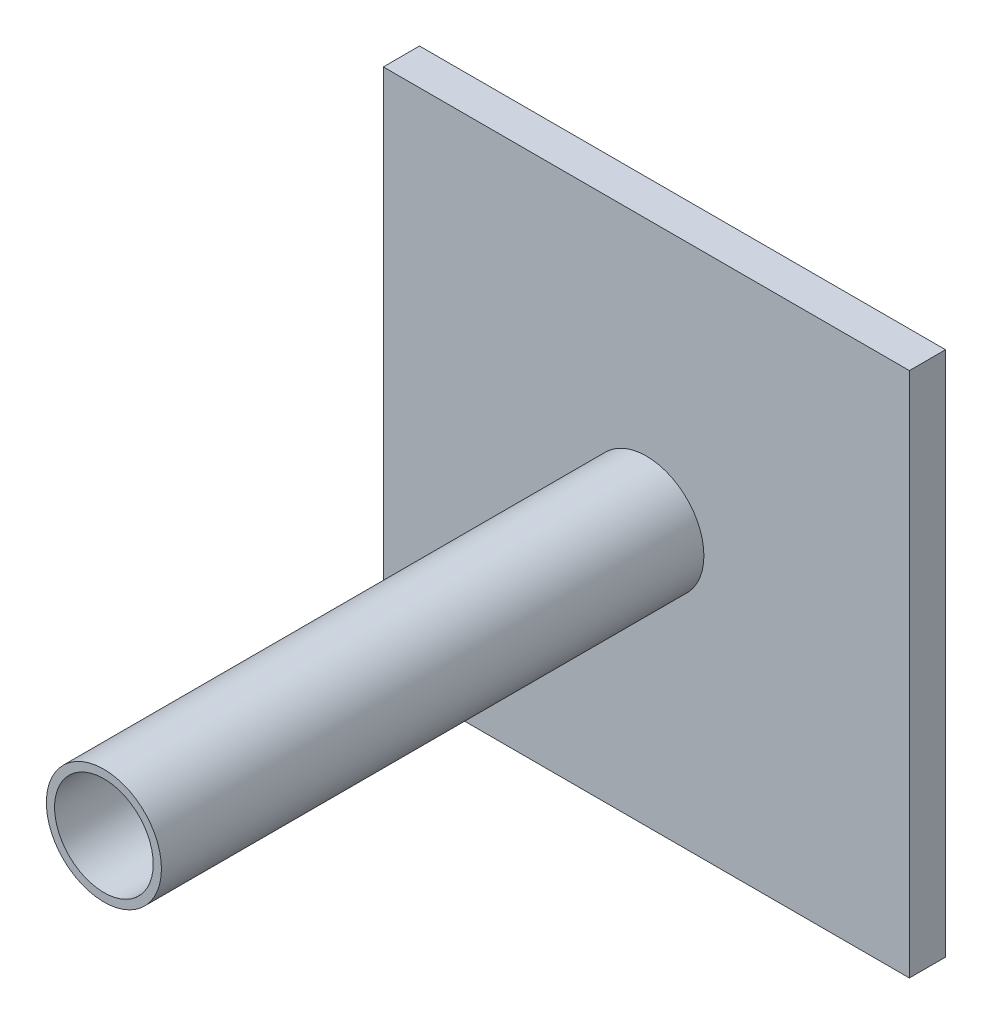
ISO-10303-21;
HEADER;
FILE_DESCRIPTION(('STEP AP214'),'2;1');
FILE_NAME('part.step','',(''),(''),'','','');
FILE_SCHEMA(('AUTOMOTIVE_DESIGN { 1 0 10303 214 1 1 1 1 }'));
ENDSEC;
DATA;
#1=APPLICATION_CONTEXT('core data for automotive mechanical design processes');
#2=APPLICATION_PROTOCOL_DEFINITION('international standard','automotive_design',2000,#1);
#3=PRODUCT_CONTEXT('',#1,'mechanical');
#4=PRODUCT('Part','Part','',(#3));
#5=PRODUCT_RELATED_PRODUCT_CATEGORY('part','',(#4));
#6=PRODUCT_DEFINITION_FORMATION('','',#4);
#7=PRODUCT_DEFINITION_CONTEXT('part definition',#1,'design');
#8=PRODUCT_DEFINITION('design','',#6,#7);
#9=PRODUCT_DEFINITION_SHAPE('','',#8);
#10=(LENGTH_UNIT() NAMED_UNIT(*) SI_UNIT(.MILLI.,.METRE.));
#11=(NAMED_UNIT(*) PLANE_ANGLE_UNIT() SI_UNIT($,.RADIAN.));
#12=(NAMED_UNIT(*) SI_UNIT($,.STERADIAN.) SOLID_ANGLE_UNIT());
#13=UNCERTAINTY_MEASURE_WITH_UNIT(LENGTH_MEASURE(1.E-05),#10,'distance_accuracy_value','');
#14=(GEOMETRIC_REPRESENTATION_CONTEXT(3) GLOBAL_UNCERTAINTY_ASSIGNED_CONTEXT((#13)) GLOBAL_UNIT_ASSIGNED_CONTEXT((#10,
#11,#12)) REPRESENTATION_CONTEXT('',''));
#15=CARTESIAN_POINT('',(0.,0.,0.));
#16=DIRECTION('',(0.,0.,1.));
#17=DIRECTION('',(1.,0.,0.));
#18=AXIS2_PLACEMENT_3D('',#15,#16,#17);
#19=CARTESIAN_POINT('',(-17.8486055776893,18.1673306772908,2.2));
#20=DIRECTION('',(1.,0.,0.));
#21=DIRECTION('',(0.,0.,-1.));
#22=AXIS2_PLACEMENT_3D('',#19,#20,#21);
#23=PLANE('',#22);
#24=DIRECTION('',(0.,-1.,0.));
#25=VECTOR('',#24,1.);
#26=CARTESIAN_POINT('',(-17.8486055776893,18.1673306772908,0.));
#27=LINE('',#26,#25);
#28=CARTESIAN_POINT('',(-17.8486055776893,18.1673306772908,0.));
#29=VERTEX_POINT('',#28);
#30=CARTESIAN_POINT('',(-17.8486055776893,-13.8326693227092,0.));
#31=VERTEX_POINT('',#30);
#32=EDGE_CURVE('E110',#29,#31,#27,.T.);
#33=ORIENTED_EDGE('',*,*,#32,.T.);
#34=DIRECTION('',(0.,0.,-1.));
#35=VECTOR('',#34,1.);
#36=CARTESIAN_POINT('',(-17.8486055776893,-13.8326693227092,2.2));
#37=LINE('',#36,#35);
#38=CARTESIAN_POINT('',(-17.8486055776893,-13.8326693227092,2.2));
#39=VERTEX_POINT('',#38);
#40=EDGE_CURVE('E42',#39,#31,#37,.T.);
#41=ORIENTED_EDGE('',*,*,#40,.F.);
#42=DIRECTION('',(0.,-1.,0.));
#43=VECTOR('',#42,1.);
#44=CARTESIAN_POINT('',(-17.8486055776893,18.1673306772908,2.2));
#45=LINE('',#44,#43);
#46=CARTESIAN_POINT('',(-17.8486055776893,18.1673306772908,2.2));
#47=VERTEX_POINT('',#46);
#48=EDGE_CURVE('E93',#47,#39,#45,.T.);
#49=ORIENTED_EDGE('',*,*,#48,.F.);
#50=DIRECTION('',(0.,0.,-1.));
#51=VECTOR('',#50,1.);
#52=CARTESIAN_POINT('',(-17.8486055776893,18.1673306772908,2.2));
#53=LINE('',#52,#51);
#54=EDGE_CURVE('E106',#47,#29,#53,.T.);
#55=ORIENTED_EDGE('',*,*,#54,.T.);
#56=EDGE_LOOP('',(#33,#41,#49,#55));
#57=FACE_BOUND('',#56,.T.);
#58=ADVANCED_FACE('F39',(#57),#23,.F.);
#59=CARTESIAN_POINT('',(-17.8486055776893,-13.8326693227092,2.2));
#60=DIRECTION('',(0.,1.,0.));
#61=DIRECTION('',(-1.,0.,0.));
#62=AXIS2_PLACEMENT_3D('',#59,#60,#61);
#63=PLANE('',#62);
#64=DIRECTION('',(1.,0.,0.));
#65=VECTOR('',#64,1.);
#66=CARTESIAN_POINT('',(-17.8486055776893,-13.8326693227092,0.));
#67=LINE('',#66,#65);
#68=CARTESIAN_POINT('',(14.1513944223108,-13.8326693227092,0.));
#69=VERTEX_POINT('',#68);
#70=EDGE_CURVE('E99',#31,#69,#67,.T.);
#71=ORIENTED_EDGE('',*,*,#70,.T.);
#72=DIRECTION('',(0.,0.,-1.));
#73=VECTOR('',#72,1.);
#74=CARTESIAN_POINT('',(14.1513944223108,-13.8326693227092,2.2));
#75=LINE('',#74,#73);
#76=CARTESIAN_POINT('',(14.1513944223108,-13.8326693227092,2.2));
#77=VERTEX_POINT('',#76);
#78=EDGE_CURVE('E97',#77,#69,#75,.T.);
#79=ORIENTED_EDGE('',*,*,#78,.F.);
#80=DIRECTION('',(1.,0.,0.));
#81=VECTOR('',#80,1.);
#82=CARTESIAN_POINT('',(-17.8486055776893,-13.8326693227092,2.2));
#83=LINE('',#82,#81);
#84=EDGE_CURVE('E88',#39,#77,#83,.T.);
#85=ORIENTED_EDGE('',*,*,#84,.F.);
#86=ORIENTED_EDGE('',*,*,#40,.T.);
#87=EDGE_LOOP('',(#71,#79,#85,#86));
#88=FACE_BOUND('',#87,.T.);
#89=ADVANCED_FACE('F98',(#88),#63,.F.);
#90=CARTESIAN_POINT('',(14.1513944223107,18.1673306772908,2.2));
#91=DIRECTION('',(-1.,0.,0.));
#92=DIRECTION('',(0.,-1.,0.));
#93=AXIS2_PLACEMENT_3D('',#90,#91,#92);
#94=PLANE('',#93);
#95=DIRECTION('',(0.,1.,0.));
#96=VECTOR('',#95,1.);
#97=CARTESIAN_POINT('',(14.1513944223107,18.1673306772908,0.));
#98=LINE('',#97,#96);
#99=CARTESIAN_POINT('',(14.1513944223107,18.1673306772908,0.));
#100=VERTEX_POINT('',#99);
#101=EDGE_CURVE('E74',#69,#100,#98,.T.);
#102=ORIENTED_EDGE('',*,*,#101,.T.);
#103=DIRECTION('',(0.,0.,-1.));
#104=VECTOR('',#103,1.);
#105=CARTESIAN_POINT('',(14.1513944223107,18.1673306772908,2.2));
#106=LINE('',#105,#104);
#107=CARTESIAN_POINT('',(14.1513944223107,18.1673306772908,2.2));
#108=VERTEX_POINT('',#107);
#109=EDGE_CURVE('E101',#108,#100,#106,.T.);
#110=ORIENTED_EDGE('',*,*,#109,.F.);
#111=DIRECTION('',(0.,1.,0.));
#112=VECTOR('',#111,1.);
#113=CARTESIAN_POINT('',(14.1513944223107,18.1673306772908,2.2));
#114=LINE('',#113,#112);
#115=EDGE_CURVE('E91',#77,#108,#114,.T.);
#116=ORIENTED_EDGE('',*,*,#115,.F.);
#117=ORIENTED_EDGE('',*,*,#78,.T.);
#118=EDGE_LOOP('',(#102,#110,#116,#117));
#119=FACE_BOUND('',#118,.T.);
#120=ADVANCED_FACE('F102',(#119),#94,.F.);
#121=CARTESIAN_POINT('',(-17.8486055776893,18.1673306772908,2.2));
#122=DIRECTION('',(0.,-1.,0.));
#123=DIRECTION('',(0.,0.,-1.));
#124=AXIS2_PLACEMENT_3D('',#121,#122,#123);
#125=PLANE('',#124);
#126=DIRECTION('',(-1.,0.,0.));
#127=VECTOR('',#126,1.);
#128=CARTESIAN_POINT('',(-17.8486055776893,18.1673306772908,0.));
#129=LINE('',#128,#127);
#130=EDGE_CURVE('E80',#100,#29,#129,.T.);
#131=ORIENTED_EDGE('',*,*,#130,.T.);
#132=ORIENTED_EDGE('',*,*,#54,.F.);
#133=DIRECTION('',(-1.,0.,0.));
#134=VECTOR('',#133,1.);
#135=CARTESIAN_POINT('',(-17.8486055776893,18.1673306772908,2.2));
#136=LINE('',#135,#134);
#137=EDGE_CURVE('E57',#108,#47,#136,.T.);
#138=ORIENTED_EDGE('',*,*,#137,.F.);
#139=ORIENTED_EDGE('',*,*,#109,.T.);
#140=EDGE_LOOP('',(#131,#132,#138,#139));
#141=FACE_BOUND('',#140,.T.);
#142=ADVANCED_FACE('F124',(#141),#125,.F.);
#143=CARTESIAN_POINT('',(0.,0.,2.2));
#144=DIRECTION('',(0.,0.,1.));
#145=DIRECTION('',(1.,0.,0.));
#146=AXIS2_PLACEMENT_3D('',#143,#144,#145);
#147=PLANE('',#146);
#148=CARTESIAN_POINT('',(-1.84860557768925,2.16733067729083,2.2));
#149=DIRECTION('',(0.,0.,1.));
#150=DIRECTION('',(1.,0.,0.));
#151=AXIS2_PLACEMENT_3D('',#148,#149,#150);
#152=CIRCLE('',#151,3.5);
#153=CARTESIAN_POINT('',(1.65139442231075,2.16733067729083,2.2));
#154=VERTEX_POINT('',#153);
#155=EDGE_CURVE('E11',#154,#154,#152,.T.);
#156=ORIENTED_EDGE('',*,*,#155,.F.);
#157=EDGE_LOOP('',(#156));
#158=FACE_BOUND('',#157,.T.);
#159=ORIENTED_EDGE('',*,*,#48,.T.);
#160=ORIENTED_EDGE('',*,*,#84,.T.);
#161=ORIENTED_EDGE('',*,*,#115,.T.);
#162=ORIENTED_EDGE('',*,*,#137,.T.);
#163=EDGE_LOOP('',(#159,#160,#161,#162));
#164=FACE_BOUND('',#163,.T.);
#165=ADVANCED_FACE('F89',(#158,#164),#147,.T.);
#166=CARTESIAN_POINT('',(0.,0.,0.));
#167=DIRECTION('',(0.,0.,1.));
#168=DIRECTION('',(1.,0.,0.));
#169=AXIS2_PLACEMENT_3D('',#166,#167,#168);
#170=PLANE('',#169);
#171=CARTESIAN_POINT('',(-1.84860557768925,2.16733067729083,0.));
#172=DIRECTION('',(0.,0.,1.));
#173=DIRECTION('',(1.,0.,0.));
#174=AXIS2_PLACEMENT_3D('',#171,#172,#173);
#175=CIRCLE('',#174,3.);
#176=CARTESIAN_POINT('',(1.15139442231075,2.16733067729083,0.));
#177=VERTEX_POINT('',#176);
#178=EDGE_CURVE('E134',#177,#177,#175,.T.);
#179=ORIENTED_EDGE('',*,*,#178,.T.);
#180=EDGE_LOOP('',(#179));
#181=FACE_BOUND('',#180,.T.);
#182=ORIENTED_EDGE('',*,*,#32,.F.);
#183=ORIENTED_EDGE('',*,*,#130,.F.);
#184=ORIENTED_EDGE('',*,*,#101,.F.);
#185=ORIENTED_EDGE('',*,*,#70,.F.);
#186=EDGE_LOOP('',(#182,#183,#184,#185));
#187=FACE_BOUND('',#186,.T.);
#188=ADVANCED_FACE('F127',(#181,#187),#170,.F.);
#189=CARTESIAN_POINT('',(-1.84860557768925,2.16733067729083,35.2));
#190=DIRECTION('',(0.,0.,-1.));
#191=DIRECTION('',(-1.,0.,0.));
#192=AXIS2_PLACEMENT_3D('',#189,#190,#191);
#193=CYLINDRICAL_SURFACE('',#192,3.5);
#194=CARTESIAN_POINT('',(-1.84860557768925,2.16733067729083,35.2));
#195=DIRECTION('',(0.,0.,1.));
#196=DIRECTION('',(1.,0.,0.));
#197=AXIS2_PLACEMENT_3D('',#194,#195,#196);
#198=CIRCLE('',#197,3.5);
#199=CARTESIAN_POINT('',(1.65139442231075,2.16733067729083,35.2));
#200=VERTEX_POINT('',#199);
#201=EDGE_CURVE('E114',#200,#200,#198,.T.);
#202=ORIENTED_EDGE('',*,*,#201,.F.);
#203=EDGE_LOOP('',(#202));
#204=FACE_BOUND('',#203,.T.);
#205=ORIENTED_EDGE('',*,*,#155,.T.);
#206=EDGE_LOOP('',(#205));
#207=FACE_BOUND('',#206,.T.);
#208=ADVANCED_FACE('F153',(#204,#207),#193,.T.);
#209=CARTESIAN_POINT('',(-1.84860557768925,2.16733067729083,35.2));
#210=DIRECTION('',(0.,0.,1.));
#211=DIRECTION('',(1.,0.,0.));
#212=AXIS2_PLACEMENT_3D('',#209,#210,#211);
#213=PLANE('',#212);
#214=CARTESIAN_POINT('',(-1.84860557768925,2.16733067729083,35.2));
#215=DIRECTION('',(0.,0.,1.));
#216=DIRECTION('',(1.,0.,0.));
#217=AXIS2_PLACEMENT_3D('',#214,#215,#216);
#218=CIRCLE('',#217,3.);
#219=CARTESIAN_POINT('',(1.15139442231075,2.16733067729083,35.2));
#220=VERTEX_POINT('',#219);
#221=EDGE_CURVE('E135',#220,#220,#218,.T.);
#222=ORIENTED_EDGE('',*,*,#221,.F.);
#223=EDGE_LOOP('',(#222));
#224=FACE_BOUND('',#223,.T.);
#225=ORIENTED_EDGE('',*,*,#201,.T.);
#226=EDGE_LOOP('',(#225));
#227=FACE_BOUND('',#226,.T.);
#228=ADVANCED_FACE('F147',(#224,#227),#213,.T.);
#229=CARTESIAN_POINT('',(-1.84860557768925,2.16733067729083,0.));
#230=DIRECTION('',(0.,0.,1.));
#231=DIRECTION('',(1.,0.,0.));
#232=AXIS2_PLACEMENT_3D('',#229,#230,#231);
#233=CYLINDRICAL_SURFACE('',#232,3.);
#234=ORIENTED_EDGE('',*,*,#178,.F.);
#235=EDGE_LOOP('',(#234));
#236=FACE_BOUND('',#235,.T.);
#237=ORIENTED_EDGE('',*,*,#221,.T.);
#238=EDGE_LOOP('',(#237));
#239=FACE_BOUND('',#238,.T.);
#240=ADVANCED_FACE('F144',(#236,#239),#233,.F.);
#241=CLOSED_SHELL('',(#58,#89,#120,#142,#165,#188,#208,#228,#240));
#242=MANIFOLD_SOLID_BREP('B2',#241);
#243=ADVANCED_BREP_SHAPE_REPRESENTATION('',(#18,#242),#14);
#244=SHAPE_DEFINITION_REPRESENTATION(#9,#243);
ENDSEC;
END-ISO-10303-21;
